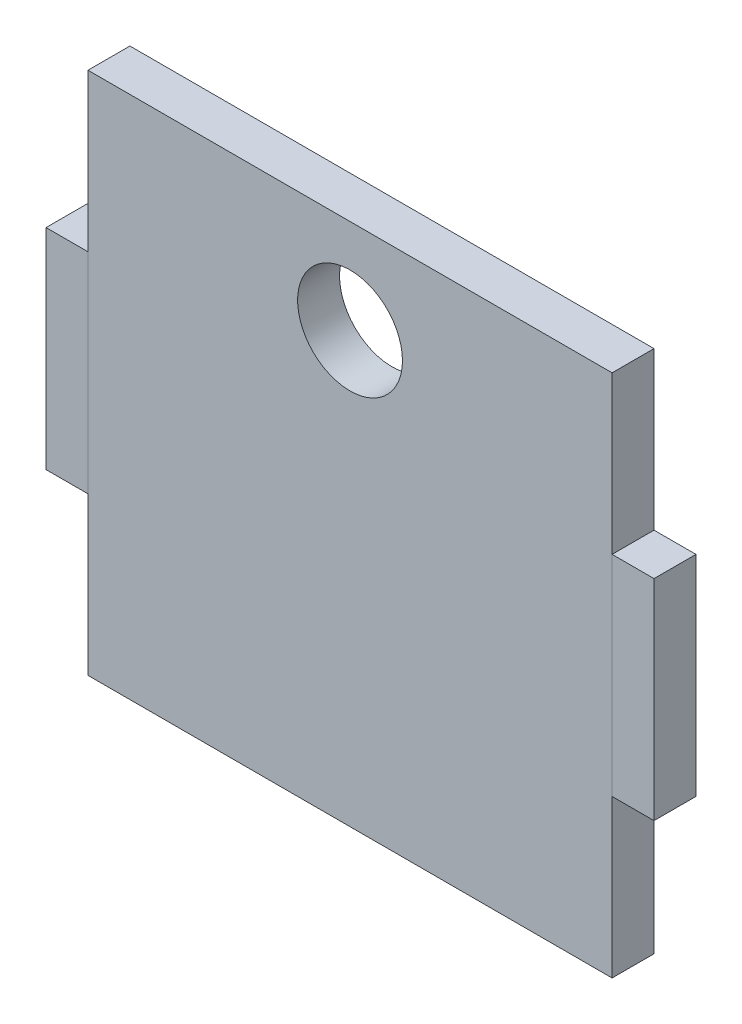
ISO-10303-21;
HEADER;
FILE_DESCRIPTION(('STEP AP214'),'2;1');
FILE_NAME('part.step','',(''),(''),'','','');
FILE_SCHEMA(('AUTOMOTIVE_DESIGN { 1 0 10303 214 1 1 1 1 }'));
ENDSEC;
DATA;
#1=APPLICATION_CONTEXT('core data for automotive mechanical design processes');
#2=APPLICATION_PROTOCOL_DEFINITION('international standard','automotive_design',2000,#1);
#3=PRODUCT_CONTEXT('',#1,'mechanical');
#4=PRODUCT('Part','Part','',(#3));
#5=PRODUCT_RELATED_PRODUCT_CATEGORY('part','',(#4));
#6=PRODUCT_DEFINITION_FORMATION('','',#4);
#7=PRODUCT_DEFINITION_CONTEXT('part definition',#1,'design');
#8=PRODUCT_DEFINITION('design','',#6,#7);
#9=PRODUCT_DEFINITION_SHAPE('','',#8);
#10=(LENGTH_UNIT() NAMED_UNIT(*) SI_UNIT(.MILLI.,.METRE.));
#11=(NAMED_UNIT(*) PLANE_ANGLE_UNIT() SI_UNIT($,.RADIAN.));
#12=(NAMED_UNIT(*) SI_UNIT($,.STERADIAN.) SOLID_ANGLE_UNIT());
#13=UNCERTAINTY_MEASURE_WITH_UNIT(LENGTH_MEASURE(1.E-05),#10,'distance_accuracy_value','');
#14=(GEOMETRIC_REPRESENTATION_CONTEXT(3) GLOBAL_UNCERTAINTY_ASSIGNED_CONTEXT((#13)) GLOBAL_UNIT_ASSIGNED_CONTEXT((#10,
#11,#12)) REPRESENTATION_CONTEXT('',''));
#15=CARTESIAN_POINT('',(0.,0.,0.));
#16=DIRECTION('',(0.,0.,1.));
#17=DIRECTION('',(1.,0.,0.));
#18=AXIS2_PLACEMENT_3D('',#15,#16,#17);
#19=CARTESIAN_POINT('',(14.5,0.,1.));
#20=DIRECTION('',(1.,0.,0.));
#21=DIRECTION('',(0.,1.,0.));
#22=AXIS2_PLACEMENT_3D('',#19,#20,#21);
#23=PLANE('',#22);
#24=DIRECTION('',(0.,0.,-1.));
#25=VECTOR('',#24,1.);
#26=CARTESIAN_POINT('',(14.5,-5.,2.));
#27=LINE('',#26,#25);
#28=CARTESIAN_POINT('',(14.5,-5.,2.));
#29=VERTEX_POINT('',#28);
#30=CARTESIAN_POINT('',(14.5,-5.,0.));
#31=VERTEX_POINT('',#30);
#32=EDGE_CURVE('E25',#29,#31,#27,.T.);
#33=ORIENTED_EDGE('',*,*,#32,.T.);
#34=DIRECTION('',(0.,1.,0.));
#35=VECTOR('',#34,1.);
#36=CARTESIAN_POINT('',(14.5,-5.,0.));
#37=LINE('',#36,#35);
#38=CARTESIAN_POINT('',(14.5,5.,0.));
#39=VERTEX_POINT('',#38);
#40=EDGE_CURVE('E214',#31,#39,#37,.T.);
#41=ORIENTED_EDGE('',*,*,#40,.T.);
#42=DIRECTION('',(0.,0.,1.));
#43=VECTOR('',#42,1.);
#44=CARTESIAN_POINT('',(14.5,5.,0.));
#45=LINE('',#44,#43);
#46=CARTESIAN_POINT('',(14.5,5.,2.));
#47=VERTEX_POINT('',#46);
#48=EDGE_CURVE('E9',#39,#47,#45,.T.);
#49=ORIENTED_EDGE('',*,*,#48,.T.);
#50=DIRECTION('',(0.,-1.,0.));
#51=VECTOR('',#50,1.);
#52=CARTESIAN_POINT('',(14.5,5.,2.));
#53=LINE('',#52,#51);
#54=EDGE_CURVE('E140',#47,#29,#53,.T.);
#55=ORIENTED_EDGE('',*,*,#54,.T.);
#56=EDGE_LOOP('',(#33,#41,#49,#55));
#57=FACE_BOUND('',#56,.T.);
#58=ADVANCED_FACE('F14',(#57),#23,.T.);
#59=CARTESIAN_POINT('',(12.5,5.,0.));
#60=DIRECTION('',(0.,-1.,0.));
#61=DIRECTION('',(0.,0.,-1.));
#62=AXIS2_PLACEMENT_3D('',#59,#60,#61);
#63=PLANE('',#62);
#64=DIRECTION('',(0.,0.,1.));
#65=VECTOR('',#64,1.);
#66=CARTESIAN_POINT('',(12.5,5.,0.));
#67=LINE('',#66,#65);
#68=CARTESIAN_POINT('',(12.5,5.,0.));
#69=VERTEX_POINT('',#68);
#70=CARTESIAN_POINT('',(12.5,5.,2.));
#71=VERTEX_POINT('',#70);
#72=EDGE_CURVE('E144',#69,#71,#67,.T.);
#73=ORIENTED_EDGE('',*,*,#72,.T.);
#74=DIRECTION('',(1.,0.,0.));
#75=VECTOR('',#74,1.);
#76=CARTESIAN_POINT('',(12.5,5.,2.));
#77=LINE('',#76,#75);
#78=EDGE_CURVE('E133',#71,#47,#77,.T.);
#79=ORIENTED_EDGE('',*,*,#78,.T.);
#80=ORIENTED_EDGE('',*,*,#48,.F.);
#81=DIRECTION('',(1.,0.,0.));
#82=VECTOR('',#81,1.);
#83=CARTESIAN_POINT('',(12.5,5.,0.));
#84=LINE('',#83,#82);
#85=EDGE_CURVE('E148',#69,#39,#84,.T.);
#86=ORIENTED_EDGE('',*,*,#85,.F.);
#87=EDGE_LOOP('',(#73,#79,#80,#86));
#88=FACE_BOUND('',#87,.T.);
#89=ADVANCED_FACE('F146',(#88),#63,.F.);
#90=CARTESIAN_POINT('',(12.5,-5.,2.));
#91=DIRECTION('',(0.,1.,0.));
#92=DIRECTION('',(1.,0.,0.));
#93=AXIS2_PLACEMENT_3D('',#90,#91,#92);
#94=PLANE('',#93);
#95=DIRECTION('',(0.,0.,-1.));
#96=VECTOR('',#95,1.);
#97=CARTESIAN_POINT('',(12.5,-5.,2.));
#98=LINE('',#97,#96);
#99=CARTESIAN_POINT('',(12.5,-5.,2.));
#100=VERTEX_POINT('',#99);
#101=CARTESIAN_POINT('',(12.5,-5.,0.));
#102=VERTEX_POINT('',#101);
#103=EDGE_CURVE('E231',#100,#102,#98,.T.);
#104=ORIENTED_EDGE('',*,*,#103,.T.);
#105=DIRECTION('',(1.,0.,0.));
#106=VECTOR('',#105,1.);
#107=CARTESIAN_POINT('',(12.5,-5.,0.));
#108=LINE('',#107,#106);
#109=EDGE_CURVE('E154',#102,#31,#108,.T.);
#110=ORIENTED_EDGE('',*,*,#109,.T.);
#111=ORIENTED_EDGE('',*,*,#32,.F.);
#112=DIRECTION('',(1.,0.,0.));
#113=VECTOR('',#112,1.);
#114=CARTESIAN_POINT('',(12.5,-5.,2.));
#115=LINE('',#114,#113);
#116=EDGE_CURVE('E178',#100,#29,#115,.T.);
#117=ORIENTED_EDGE('',*,*,#116,.F.);
#118=EDGE_LOOP('',(#104,#110,#111,#117));
#119=FACE_BOUND('',#118,.T.);
#120=ADVANCED_FACE('F374',(#119),#94,.F.);
#121=CARTESIAN_POINT('',(-12.5,-5.,0.));
#122=DIRECTION('',(0.,1.,0.));
#123=DIRECTION('',(1.,0.,0.));
#124=AXIS2_PLACEMENT_3D('',#121,#122,#123);
#125=PLANE('',#124);
#126=DIRECTION('',(0.,0.,1.));
#127=VECTOR('',#126,1.);
#128=CARTESIAN_POINT('',(-12.5,-5.,0.));
#129=LINE('',#128,#127);
#130=CARTESIAN_POINT('',(-12.5,-5.,0.));
#131=VERTEX_POINT('',#130);
#132=CARTESIAN_POINT('',(-12.5,-5.,2.));
#133=VERTEX_POINT('',#132);
#134=EDGE_CURVE('E180',#131,#133,#129,.T.);
#135=ORIENTED_EDGE('',*,*,#134,.T.);
#136=DIRECTION('',(-1.,0.,0.));
#137=VECTOR('',#136,1.);
#138=CARTESIAN_POINT('',(-12.5,-5.,2.));
#139=LINE('',#138,#137);
#140=CARTESIAN_POINT('',(-14.5,-5.,2.));
#141=VERTEX_POINT('',#140);
#142=EDGE_CURVE('E194',#133,#141,#139,.T.);
#143=ORIENTED_EDGE('',*,*,#142,.T.);
#144=DIRECTION('',(0.,0.,1.));
#145=VECTOR('',#144,1.);
#146=CARTESIAN_POINT('',(-14.5,-5.,0.));
#147=LINE('',#146,#145);
#148=CARTESIAN_POINT('',(-14.5,-5.,0.));
#149=VERTEX_POINT('',#148);
#150=EDGE_CURVE('E192',#149,#141,#147,.T.);
#151=ORIENTED_EDGE('',*,*,#150,.F.);
#152=DIRECTION('',(-1.,0.,0.));
#153=VECTOR('',#152,1.);
#154=CARTESIAN_POINT('',(-12.5,-5.,0.));
#155=LINE('',#154,#153);
#156=EDGE_CURVE('E228',#131,#149,#155,.T.);
#157=ORIENTED_EDGE('',*,*,#156,.F.);
#158=EDGE_LOOP('',(#135,#143,#151,#157));
#159=FACE_BOUND('',#158,.T.);
#160=ADVANCED_FACE('F385',(#159),#125,.F.);
#161=CARTESIAN_POINT('',(12.5,5.,2.));
#162=DIRECTION('',(0.,0.,-1.));
#163=DIRECTION('',(0.,-1.,0.));
#164=AXIS2_PLACEMENT_3D('',#161,#162,#163);
#165=PLANE('',#164);
#166=DIRECTION('',(0.,-1.,0.));
#167=VECTOR('',#166,1.);
#168=CARTESIAN_POINT('',(12.5,5.,2.));
#169=LINE('',#168,#167);
#170=EDGE_CURVE('E138',#71,#100,#169,.T.);
#171=ORIENTED_EDGE('',*,*,#170,.T.);
#172=ORIENTED_EDGE('',*,*,#116,.T.);
#173=ORIENTED_EDGE('',*,*,#54,.F.);
#174=ORIENTED_EDGE('',*,*,#78,.F.);
#175=EDGE_LOOP('',(#171,#172,#173,#174));
#176=FACE_BOUND('',#175,.T.);
#177=ADVANCED_FACE('F135',(#176),#165,.F.);
#178=CARTESIAN_POINT('',(-14.5,0.,1.));
#179=DIRECTION('',(1.,0.,0.));
#180=DIRECTION('',(0.,1.,0.));
#181=AXIS2_PLACEMENT_3D('',#178,#179,#180);
#182=PLANE('',#181);
#183=DIRECTION('',(0.,0.,-1.));
#184=VECTOR('',#183,1.);
#185=CARTESIAN_POINT('',(-14.5,5.,2.));
#186=LINE('',#185,#184);
#187=CARTESIAN_POINT('',(-14.5,5.,2.));
#188=VERTEX_POINT('',#187);
#189=CARTESIAN_POINT('',(-14.5,5.,0.));
#190=VERTEX_POINT('',#189);
#191=EDGE_CURVE('E222',#188,#190,#186,.T.);
#192=ORIENTED_EDGE('',*,*,#191,.T.);
#193=DIRECTION('',(0.,-1.,0.));
#194=VECTOR('',#193,1.);
#195=CARTESIAN_POINT('',(-14.5,5.,0.));
#196=LINE('',#195,#194);
#197=EDGE_CURVE('E217',#190,#149,#196,.T.);
#198=ORIENTED_EDGE('',*,*,#197,.T.);
#199=ORIENTED_EDGE('',*,*,#150,.T.);
#200=DIRECTION('',(0.,1.,0.));
#201=VECTOR('',#200,1.);
#202=CARTESIAN_POINT('',(-14.5,-5.,2.));
#203=LINE('',#202,#201);
#204=EDGE_CURVE('E223',#141,#188,#203,.T.);
#205=ORIENTED_EDGE('',*,*,#204,.T.);
#206=EDGE_LOOP('',(#192,#198,#199,#205));
#207=FACE_BOUND('',#206,.T.);
#208=ADVANCED_FACE('F417',(#207),#182,.F.);
#209=CARTESIAN_POINT('',(-12.5,-5.,2.));
#210=DIRECTION('',(0.,0.,-1.));
#211=DIRECTION('',(0.,-1.,0.));
#212=AXIS2_PLACEMENT_3D('',#209,#210,#211);
#213=PLANE('',#212);
#214=DIRECTION('',(0.,1.,0.));
#215=VECTOR('',#214,1.);
#216=CARTESIAN_POINT('',(-12.5,-5.,2.));
#217=LINE('',#216,#215);
#218=CARTESIAN_POINT('',(-12.5,5.,2.));
#219=VERTEX_POINT('',#218);
#220=EDGE_CURVE('E301',#133,#219,#217,.T.);
#221=ORIENTED_EDGE('',*,*,#220,.T.);
#222=DIRECTION('',(-1.,0.,0.));
#223=VECTOR('',#222,1.);
#224=CARTESIAN_POINT('',(-12.5,5.,2.));
#225=LINE('',#224,#223);
#226=EDGE_CURVE('E262',#219,#188,#225,.T.);
#227=ORIENTED_EDGE('',*,*,#226,.T.);
#228=ORIENTED_EDGE('',*,*,#204,.F.);
#229=ORIENTED_EDGE('',*,*,#142,.F.);
#230=EDGE_LOOP('',(#221,#227,#228,#229));
#231=FACE_BOUND('',#230,.T.);
#232=ADVANCED_FACE('F477',(#231),#213,.F.);
#233=CARTESIAN_POINT('',(0.,8.,0.));
#234=DIRECTION('',(0.,0.,-1.));
#235=DIRECTION('',(1.,0.,0.));
#236=AXIS2_PLACEMENT_3D('',#233,#234,#235);
#237=CYLINDRICAL_SURFACE('',#236,2.5);
#238=DIRECTION('',(0.,0.,1.));
#239=VECTOR('',#238,1.);
#240=CARTESIAN_POINT('',(2.5,8.,0.));
#241=LINE('',#240,#239);
#242=CARTESIAN_POINT('',(2.5,8.,0.));
#243=VERTEX_POINT('',#242);
#244=CARTESIAN_POINT('',(2.5,8.,2.));
#245=VERTEX_POINT('',#244);
#246=EDGE_CURVE('E153',#243,#245,#241,.T.);
#247=ORIENTED_EDGE('',*,*,#246,.T.);
#248=CARTESIAN_POINT('',(0.,8.,2.));
#249=DIRECTION('',(0.,0.,1.));
#250=DIRECTION('',(1.,0.,0.));
#251=AXIS2_PLACEMENT_3D('',#248,#249,#250);
#252=CIRCLE('',#251,2.5);
#253=EDGE_CURVE('E198',#245,#245,#252,.T.);
#254=ORIENTED_EDGE('',*,*,#253,.T.);
#255=ORIENTED_EDGE('',*,*,#246,.F.);
#256=CARTESIAN_POINT('',(0.,8.,0.));
#257=DIRECTION('',(0.,0.,1.));
#258=DIRECTION('',(1.,0.,0.));
#259=AXIS2_PLACEMENT_3D('',#256,#257,#258);
#260=CIRCLE('',#259,2.5);
#261=EDGE_CURVE('E190',#243,#243,#260,.T.);
#262=ORIENTED_EDGE('',*,*,#261,.F.);
#263=EDGE_LOOP('',(#247,#254,#255,#262));
#264=FACE_BOUND('',#263,.T.);
#265=ADVANCED_FACE('F427',(#264),#237,.F.);
#266=CARTESIAN_POINT('',(12.5,-12.5,0.));
#267=DIRECTION('',(-1.,0.,0.));
#268=DIRECTION('',(0.,0.,1.));
#269=AXIS2_PLACEMENT_3D('',#266,#267,#268);
#270=PLANE('',#269);
#271=DIRECTION('',(0.,0.,1.));
#272=VECTOR('',#271,1.);
#273=CARTESIAN_POINT('',(12.5,12.5,0.));
#274=LINE('',#273,#272);
#275=CARTESIAN_POINT('',(12.5,12.5,0.));
#276=VERTEX_POINT('',#275);
#277=CARTESIAN_POINT('',(12.5,12.5,2.));
#278=VERTEX_POINT('',#277);
#279=EDGE_CURVE('E159',#276,#278,#274,.T.);
#280=ORIENTED_EDGE('',*,*,#279,.T.);
#281=DIRECTION('',(0.,1.,0.));
#282=VECTOR('',#281,1.);
#283=CARTESIAN_POINT('',(12.5,-12.5,2.));
#284=LINE('',#283,#282);
#285=EDGE_CURVE('E157',#71,#278,#284,.T.);
#286=ORIENTED_EDGE('',*,*,#285,.F.);
#287=ORIENTED_EDGE('',*,*,#72,.F.);
#288=DIRECTION('',(0.,1.,0.));
#289=VECTOR('',#288,1.);
#290=CARTESIAN_POINT('',(12.5,-12.5,0.));
#291=LINE('',#290,#289);
#292=EDGE_CURVE('E203',#69,#276,#291,.T.);
#293=ORIENTED_EDGE('',*,*,#292,.T.);
#294=EDGE_LOOP('',(#280,#286,#287,#293));
#295=FACE_BOUND('',#294,.T.);
#296=ADVANCED_FACE('F158',(#295),#270,.F.);
#297=CARTESIAN_POINT('',(12.5,-5.,0.));
#298=DIRECTION('',(0.,0.,1.));
#299=DIRECTION('',(1.,0.,0.));
#300=AXIS2_PLACEMENT_3D('',#297,#298,#299);
#301=PLANE('',#300);
#302=DIRECTION('',(0.,1.,0.));
#303=VECTOR('',#302,1.);
#304=CARTESIAN_POINT('',(12.5,-5.,0.));
#305=LINE('',#304,#303);
#306=EDGE_CURVE('E207',#102,#69,#305,.T.);
#307=ORIENTED_EDGE('',*,*,#306,.T.);
#308=ORIENTED_EDGE('',*,*,#85,.T.);
#309=ORIENTED_EDGE('',*,*,#40,.F.);
#310=ORIENTED_EDGE('',*,*,#109,.F.);
#311=EDGE_LOOP('',(#307,#308,#309,#310));
#312=FACE_BOUND('',#311,.T.);
#313=ADVANCED_FACE('F16',(#312),#301,.F.);
#314=CARTESIAN_POINT('',(12.5,-12.5,0.));
#315=DIRECTION('',(-1.,0.,0.));
#316=DIRECTION('',(0.,0.,1.));
#317=AXIS2_PLACEMENT_3D('',#314,#315,#316);
#318=PLANE('',#317);
#319=ORIENTED_EDGE('',*,*,#103,.F.);
#320=DIRECTION('',(0.,1.,0.));
#321=VECTOR('',#320,1.);
#322=CARTESIAN_POINT('',(12.5,-12.5,2.));
#323=LINE('',#322,#321);
#324=CARTESIAN_POINT('',(12.5,-12.5,2.));
#325=VERTEX_POINT('',#324);
#326=EDGE_CURVE('E18',#325,#100,#323,.T.);
#327=ORIENTED_EDGE('',*,*,#326,.F.);
#328=DIRECTION('',(0.,0.,1.));
#329=VECTOR('',#328,1.);
#330=CARTESIAN_POINT('',(12.5,-12.5,0.));
#331=LINE('',#330,#329);
#332=CARTESIAN_POINT('',(12.5,-12.5,0.));
#333=VERTEX_POINT('',#332);
#334=EDGE_CURVE('E184',#333,#325,#331,.T.);
#335=ORIENTED_EDGE('',*,*,#334,.F.);
#336=DIRECTION('',(0.,1.,0.));
#337=VECTOR('',#336,1.);
#338=CARTESIAN_POINT('',(12.5,-12.5,0.));
#339=LINE('',#338,#337);
#340=EDGE_CURVE('E243',#333,#102,#339,.T.);
#341=ORIENTED_EDGE('',*,*,#340,.T.);
#342=EDGE_LOOP('',(#319,#327,#335,#341));
#343=FACE_BOUND('',#342,.T.);
#344=ADVANCED_FACE('F350',(#343),#318,.F.);
#345=CARTESIAN_POINT('',(-12.5,-12.5,0.));
#346=DIRECTION('',(0.,1.,0.));
#347=DIRECTION('',(1.,0.,0.));
#348=AXIS2_PLACEMENT_3D('',#345,#346,#347);
#349=PLANE('',#348);
#350=DIRECTION('',(1.,0.,0.));
#351=VECTOR('',#350,1.);
#352=CARTESIAN_POINT('',(-12.5,-12.5,0.));
#353=LINE('',#352,#351);
#354=CARTESIAN_POINT('',(-12.5,-12.5,0.));
#355=VERTEX_POINT('',#354);
#356=EDGE_CURVE('E247',#355,#333,#353,.T.);
#357=ORIENTED_EDGE('',*,*,#356,.T.);
#358=ORIENTED_EDGE('',*,*,#334,.T.);
#359=DIRECTION('',(1.,0.,0.));
#360=VECTOR('',#359,1.);
#361=CARTESIAN_POINT('',(-12.5,-12.5,2.));
#362=LINE('',#361,#360);
#363=CARTESIAN_POINT('',(-12.5,-12.5,2.));
#364=VERTEX_POINT('',#363);
#365=EDGE_CURVE('E175',#364,#325,#362,.T.);
#366=ORIENTED_EDGE('',*,*,#365,.F.);
#367=DIRECTION('',(0.,0.,1.));
#368=VECTOR('',#367,1.);
#369=CARTESIAN_POINT('',(-12.5,-12.5,0.));
#370=LINE('',#369,#368);
#371=EDGE_CURVE('E185',#355,#364,#370,.T.);
#372=ORIENTED_EDGE('',*,*,#371,.F.);
#373=EDGE_LOOP('',(#357,#358,#366,#372));
#374=FACE_BOUND('',#373,.T.);
#375=ADVANCED_FACE('F324',(#374),#349,.F.);
#376=CARTESIAN_POINT('',(-12.5,12.5,0.));
#377=DIRECTION('',(1.,0.,0.));
#378=DIRECTION('',(0.,1.,0.));
#379=AXIS2_PLACEMENT_3D('',#376,#377,#378);
#380=PLANE('',#379);
#381=ORIENTED_EDGE('',*,*,#371,.T.);
#382=DIRECTION('',(0.,-1.,0.));
#383=VECTOR('',#382,1.);
#384=CARTESIAN_POINT('',(-12.5,12.5,2.));
#385=LINE('',#384,#383);
#386=EDGE_CURVE('E210',#133,#364,#385,.T.);
#387=ORIENTED_EDGE('',*,*,#386,.F.);
#388=ORIENTED_EDGE('',*,*,#134,.F.);
#389=DIRECTION('',(0.,-1.,0.));
#390=VECTOR('',#389,1.);
#391=CARTESIAN_POINT('',(-12.5,12.5,0.));
#392=LINE('',#391,#390);
#393=EDGE_CURVE('E191',#131,#355,#392,.T.);
#394=ORIENTED_EDGE('',*,*,#393,.T.);
#395=EDGE_LOOP('',(#381,#387,#388,#394));
#396=FACE_BOUND('',#395,.T.);
#397=ADVANCED_FACE('F316',(#396),#380,.F.);
#398=CARTESIAN_POINT('',(-12.5,5.,0.));
#399=DIRECTION('',(0.,0.,1.));
#400=DIRECTION('',(1.,0.,0.));
#401=AXIS2_PLACEMENT_3D('',#398,#399,#400);
#402=PLANE('',#401);
#403=DIRECTION('',(0.,-1.,0.));
#404=VECTOR('',#403,1.);
#405=CARTESIAN_POINT('',(-12.5,5.,0.));
#406=LINE('',#405,#404);
#407=CARTESIAN_POINT('',(-12.5,5.,0.));
#408=VERTEX_POINT('',#407);
#409=EDGE_CURVE('E186',#408,#131,#406,.T.);
#410=ORIENTED_EDGE('',*,*,#409,.T.);
#411=ORIENTED_EDGE('',*,*,#156,.T.);
#412=ORIENTED_EDGE('',*,*,#197,.F.);
#413=DIRECTION('',(-1.,0.,0.));
#414=VECTOR('',#413,1.);
#415=CARTESIAN_POINT('',(-12.5,5.,0.));
#416=LINE('',#415,#414);
#417=EDGE_CURVE('E218',#408,#190,#416,.T.);
#418=ORIENTED_EDGE('',*,*,#417,.F.);
#419=EDGE_LOOP('',(#410,#411,#412,#418));
#420=FACE_BOUND('',#419,.T.);
#421=ADVANCED_FACE('F358',(#420),#402,.F.);
#422=CARTESIAN_POINT('',(12.5,12.5,0.));
#423=DIRECTION('',(0.,-1.,0.));
#424=DIRECTION('',(0.,0.,-1.));
#425=AXIS2_PLACEMENT_3D('',#422,#423,#424);
#426=PLANE('',#425);
#427=DIRECTION('',(-1.,0.,0.));
#428=VECTOR('',#427,1.);
#429=CARTESIAN_POINT('',(12.5,12.5,0.));
#430=LINE('',#429,#428);
#431=CARTESIAN_POINT('',(-12.5,12.5,0.));
#432=VERTEX_POINT('',#431);
#433=EDGE_CURVE('E199',#276,#432,#430,.T.);
#434=ORIENTED_EDGE('',*,*,#433,.T.);
#435=DIRECTION('',(0.,0.,1.));
#436=VECTOR('',#435,1.);
#437=CARTESIAN_POINT('',(-12.5,12.5,0.));
#438=LINE('',#437,#436);
#439=CARTESIAN_POINT('',(-12.5,12.5,2.));
#440=VERTEX_POINT('',#439);
#441=EDGE_CURVE('E241',#432,#440,#438,.T.);
#442=ORIENTED_EDGE('',*,*,#441,.T.);
#443=DIRECTION('',(-1.,0.,0.));
#444=VECTOR('',#443,1.);
#445=CARTESIAN_POINT('',(12.5,12.5,2.));
#446=LINE('',#445,#444);
#447=EDGE_CURVE('E163',#278,#440,#446,.T.);
#448=ORIENTED_EDGE('',*,*,#447,.F.);
#449=ORIENTED_EDGE('',*,*,#279,.F.);
#450=EDGE_LOOP('',(#434,#442,#448,#449));
#451=FACE_BOUND('',#450,.T.);
#452=ADVANCED_FACE('F338',(#451),#426,.F.);
#453=CARTESIAN_POINT('',(0.,0.919751287518,2.));
#454=DIRECTION('',(0.,0.,1.));
#455=DIRECTION('',(1.,0.,0.));
#456=AXIS2_PLACEMENT_3D('',#453,#454,#455);
#457=PLANE('',#456);
#458=ORIENTED_EDGE('',*,*,#253,.F.);
#459=EDGE_LOOP('',(#458));
#460=FACE_BOUND('',#459,.T.);
#461=DIRECTION('',(0.,-1.,0.));
#462=VECTOR('',#461,1.);
#463=CARTESIAN_POINT('',(-12.5,12.5,2.));
#464=LINE('',#463,#462);
#465=EDGE_CURVE('E238',#440,#219,#464,.T.);
#466=ORIENTED_EDGE('',*,*,#465,.T.);
#467=ORIENTED_EDGE('',*,*,#220,.F.);
#468=ORIENTED_EDGE('',*,*,#386,.T.);
#469=ORIENTED_EDGE('',*,*,#365,.T.);
#470=ORIENTED_EDGE('',*,*,#326,.T.);
#471=ORIENTED_EDGE('',*,*,#170,.F.);
#472=ORIENTED_EDGE('',*,*,#285,.T.);
#473=ORIENTED_EDGE('',*,*,#447,.T.);
#474=EDGE_LOOP('',(#466,#467,#468,#469,#470,#471,#472,#473));
#475=FACE_BOUND('',#474,.T.);
#476=ADVANCED_FACE('F166',(#460,#475),#457,.T.);
#477=CARTESIAN_POINT('',(-12.5,5.,2.));
#478=DIRECTION('',(0.,-1.,0.));
#479=DIRECTION('',(0.,0.,-1.));
#480=AXIS2_PLACEMENT_3D('',#477,#478,#479);
#481=PLANE('',#480);
#482=DIRECTION('',(0.,0.,-1.));
#483=VECTOR('',#482,1.);
#484=CARTESIAN_POINT('',(-12.5,5.,2.));
#485=LINE('',#484,#483);
#486=EDGE_CURVE('E242',#219,#408,#485,.T.);
#487=ORIENTED_EDGE('',*,*,#486,.T.);
#488=ORIENTED_EDGE('',*,*,#417,.T.);
#489=ORIENTED_EDGE('',*,*,#191,.F.);
#490=ORIENTED_EDGE('',*,*,#226,.F.);
#491=EDGE_LOOP('',(#487,#488,#489,#490));
#492=FACE_BOUND('',#491,.T.);
#493=ADVANCED_FACE('F274',(#492),#481,.F.);
#494=CARTESIAN_POINT('',(0.,0.919751287518,0.));
#495=DIRECTION('',(0.,0.,1.));
#496=DIRECTION('',(1.,0.,0.));
#497=AXIS2_PLACEMENT_3D('',#494,#495,#496);
#498=PLANE('',#497);
#499=ORIENTED_EDGE('',*,*,#261,.T.);
#500=EDGE_LOOP('',(#499));
#501=FACE_BOUND('',#500,.T.);
#502=ORIENTED_EDGE('',*,*,#433,.F.);
#503=ORIENTED_EDGE('',*,*,#292,.F.);
#504=ORIENTED_EDGE('',*,*,#306,.F.);
#505=ORIENTED_EDGE('',*,*,#340,.F.);
#506=ORIENTED_EDGE('',*,*,#356,.F.);
#507=ORIENTED_EDGE('',*,*,#393,.F.);
#508=ORIENTED_EDGE('',*,*,#409,.F.);
#509=DIRECTION('',(0.,-1.,0.));
#510=VECTOR('',#509,1.);
#511=CARTESIAN_POINT('',(-12.5,12.5,0.));
#512=LINE('',#511,#510);
#513=EDGE_CURVE('E204',#432,#408,#512,.T.);
#514=ORIENTED_EDGE('',*,*,#513,.F.);
#515=EDGE_LOOP('',(#502,#503,#504,#505,#506,#507,#508,#514));
#516=FACE_BOUND('',#515,.T.);
#517=ADVANCED_FACE('F321',(#501,#516),#498,.F.);
#518=CARTESIAN_POINT('',(-12.5,12.5,0.));
#519=DIRECTION('',(1.,0.,0.));
#520=DIRECTION('',(0.,1.,0.));
#521=AXIS2_PLACEMENT_3D('',#518,#519,#520);
#522=PLANE('',#521);
#523=ORIENTED_EDGE('',*,*,#486,.F.);
#524=ORIENTED_EDGE('',*,*,#465,.F.);
#525=ORIENTED_EDGE('',*,*,#441,.F.);
#526=ORIENTED_EDGE('',*,*,#513,.T.);
#527=EDGE_LOOP('',(#523,#524,#525,#526));
#528=FACE_BOUND('',#527,.T.);
#529=ADVANCED_FACE('F280',(#528),#522,.F.);
#530=CLOSED_SHELL('',(#58,#89,#120,#160,#177,#208,#232,#265,#296,#313,#344,#375,#397,#421,#452,
#476,#493,#517,#529));
#531=MANIFOLD_SOLID_BREP('B1',#530);
#532=ADVANCED_BREP_SHAPE_REPRESENTATION('',(#18,#531),#14);
#533=SHAPE_DEFINITION_REPRESENTATION(#9,#532);
ENDSEC;
END-ISO-10303-21;
